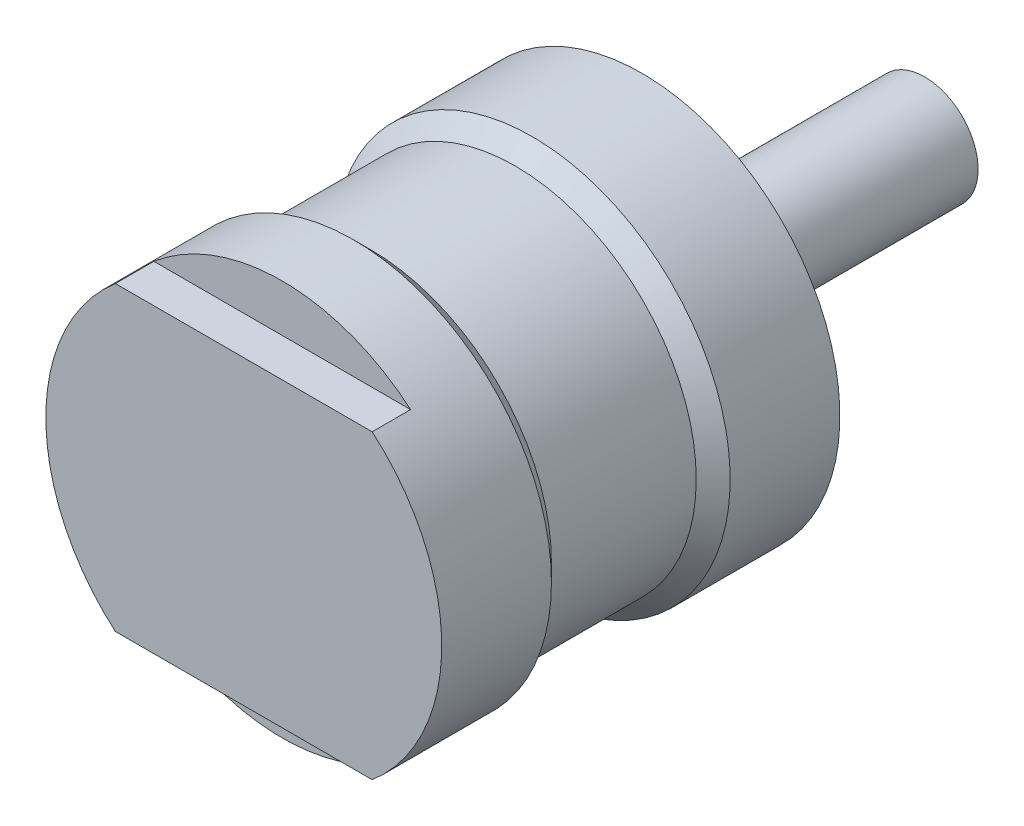
ISO-10303-21;
HEADER;
FILE_DESCRIPTION(('STEP AP214'),'2;1');
FILE_NAME('part.step','',(''),(''),'','','');
FILE_SCHEMA(('AUTOMOTIVE_DESIGN { 1 0 10303 214 1 1 1 1 }'));
ENDSEC;
DATA;
#1=APPLICATION_CONTEXT('core data for automotive mechanical design processes');
#2=APPLICATION_PROTOCOL_DEFINITION('international standard','automotive_design',2000,#1);
#3=PRODUCT_CONTEXT('',#1,'mechanical');
#4=PRODUCT('Part','Part','',(#3));
#5=PRODUCT_RELATED_PRODUCT_CATEGORY('part','',(#4));
#6=PRODUCT_DEFINITION_FORMATION('','',#4);
#7=PRODUCT_DEFINITION_CONTEXT('part definition',#1,'design');
#8=PRODUCT_DEFINITION('design','',#6,#7);
#9=PRODUCT_DEFINITION_SHAPE('','',#8);
#10=(LENGTH_UNIT() NAMED_UNIT(*) SI_UNIT(.MILLI.,.METRE.));
#11=(NAMED_UNIT(*) PLANE_ANGLE_UNIT() SI_UNIT($,.RADIAN.));
#12=(NAMED_UNIT(*) SI_UNIT($,.STERADIAN.) SOLID_ANGLE_UNIT());
#13=UNCERTAINTY_MEASURE_WITH_UNIT(LENGTH_MEASURE(1.E-05),#10,'distance_accuracy_value','');
#14=(GEOMETRIC_REPRESENTATION_CONTEXT(3) GLOBAL_UNCERTAINTY_ASSIGNED_CONTEXT((#13)) GLOBAL_UNIT_ASSIGNED_CONTEXT((#10,
#11,#12)) REPRESENTATION_CONTEXT('',''));
#15=CARTESIAN_POINT('',(0.,0.,0.));
#16=DIRECTION('',(0.,0.,1.));
#17=DIRECTION('',(1.,0.,0.));
#18=AXIS2_PLACEMENT_3D('',#15,#16,#17);
#19=CARTESIAN_POINT('',(0.,0.,-2.54));
#20=DIRECTION('',(0.,0.,-1.));
#21=DIRECTION('',(-1.,0.,0.));
#22=AXIS2_PLACEMENT_3D('',#19,#20,#21);
#23=PLANE('',#22);
#24=CARTESIAN_POINT('',(0.,0.,-2.54));
#25=DIRECTION('',(0.,0.,-1.));
#26=DIRECTION('',(-1.,0.,0.));
#27=AXIS2_PLACEMENT_3D('',#24,#25,#26);
#28=CIRCLE('',#27,3.937);
#29=CARTESIAN_POINT('',(-3.937,0.,-2.54));
#30=VERTEX_POINT('',#29);
#31=EDGE_CURVE('E380',#30,#30,#28,.T.);
#32=ORIENTED_EDGE('',*,*,#31,.T.);
#33=EDGE_LOOP('',(#32));
#34=FACE_BOUND('',#33,.T.);
#35=CARTESIAN_POINT('',(0.,0.,-2.54));
#36=DIRECTION('',(0.,0.,-1.));
#37=DIRECTION('',(-1.,0.,0.));
#38=AXIS2_PLACEMENT_3D('',#35,#36,#37);
#39=CIRCLE('',#38,2.9972);
#40=CARTESIAN_POINT('',(-2.9972,0.,-2.54));
#41=VERTEX_POINT('',#40);
#42=EDGE_CURVE('E371',#41,#41,#39,.T.);
#43=ORIENTED_EDGE('',*,*,#42,.F.);
#44=EDGE_LOOP('',(#43));
#45=FACE_BOUND('',#44,.T.);
#46=ADVANCED_FACE('F35',(#34,#45),#23,.T.);
#47=CARTESIAN_POINT('',(0.,0.,-0.762));
#48=DIRECTION('',(0.,0.,-1.));
#49=DIRECTION('',(-1.,0.,0.));
#50=AXIS2_PLACEMENT_3D('',#47,#48,#49);
#51=PLANE('',#50);
#52=CARTESIAN_POINT('',(0.,0.,-0.762));
#53=DIRECTION('',(0.,0.,-1.));
#54=DIRECTION('',(-1.,0.,0.));
#55=AXIS2_PLACEMENT_3D('',#52,#53,#54);
#56=CIRCLE('',#55,5.08);
#57=CARTESIAN_POINT('',(5.08,0.,-0.762));
#58=VERTEX_POINT('',#57);
#59=EDGE_CURVE('E97',#58,#58,#56,.T.);
#60=ORIENTED_EDGE('',*,*,#59,.T.);
#61=EDGE_LOOP('',(#60));
#62=FACE_BOUND('',#61,.T.);
#63=CARTESIAN_POINT('',(0.,0.,-0.762));
#64=DIRECTION('',(0.,0.,-1.));
#65=DIRECTION('',(-1.,0.,0.));
#66=AXIS2_PLACEMENT_3D('',#63,#64,#65);
#67=CIRCLE('',#66,3.937);
#68=CARTESIAN_POINT('',(-3.937,0.,-0.762));
#69=VERTEX_POINT('',#68);
#70=EDGE_CURVE('E377',#69,#69,#67,.T.);
#71=ORIENTED_EDGE('',*,*,#70,.F.);
#72=EDGE_LOOP('',(#71));
#73=FACE_BOUND('',#72,.T.);
#74=ADVANCED_FACE('F142',(#62,#73),#51,.T.);
#75=CARTESIAN_POINT('',(0.,0.,0.));
#76=DIRECTION('',(0.,0.,1.));
#77=DIRECTION('',(1.,0.,0.));
#78=AXIS2_PLACEMENT_3D('',#75,#76,#77);
#79=PLANE('',#78);
#80=CARTESIAN_POINT('',(3.5,6.06217782649107,0.));
#81=DIRECTION('',(0.,0.,-1.));
#82=DIRECTION('',(-1.,0.,0.));
#83=AXIS2_PLACEMENT_3D('',#80,#81,#82);
#84=CIRCLE('',#83,1.25);
#85=CARTESIAN_POINT('',(2.25,6.06217782649107,0.));
#86=VERTEX_POINT('',#85);
#87=EDGE_CURVE('E357',#86,#86,#84,.T.);
#88=ORIENTED_EDGE('',*,*,#87,.F.);
#89=EDGE_LOOP('',(#88));
#90=FACE_BOUND('',#89,.T.);
#91=CARTESIAN_POINT('',(3.5,-6.06217782649107,0.));
#92=DIRECTION('',(0.,0.,-1.));
#93=DIRECTION('',(-1.,0.,0.));
#94=AXIS2_PLACEMENT_3D('',#91,#92,#93);
#95=CIRCLE('',#94,1.25);
#96=CARTESIAN_POINT('',(2.25,-6.06217782649107,0.));
#97=VERTEX_POINT('',#96);
#98=EDGE_CURVE('E356',#97,#97,#95,.T.);
#99=ORIENTED_EDGE('',*,*,#98,.F.);
#100=EDGE_LOOP('',(#99));
#101=FACE_BOUND('',#100,.T.);
#102=CARTESIAN_POINT('',(-7.,0.,0.));
#103=DIRECTION('',(0.,0.,-1.));
#104=DIRECTION('',(-1.,0.,0.));
#105=AXIS2_PLACEMENT_3D('',#102,#103,#104);
#106=CIRCLE('',#105,1.25);
#107=CARTESIAN_POINT('',(-8.25,0.,0.));
#108=VERTEX_POINT('',#107);
#109=EDGE_CURVE('E366',#108,#108,#106,.T.);
#110=ORIENTED_EDGE('',*,*,#109,.F.);
#111=EDGE_LOOP('',(#110));
#112=FACE_BOUND('',#111,.T.);
#113=CARTESIAN_POINT('',(0.,0.,0.));
#114=DIRECTION('',(0.,0.,1.));
#115=DIRECTION('',(1.,0.,0.));
#116=AXIS2_PLACEMENT_3D('',#113,#114,#115);
#117=CIRCLE('',#116,11.1125);
#118=CARTESIAN_POINT('',(-11.1125,0.,0.));
#119=VERTEX_POINT('',#118);
#120=EDGE_CURVE('E113',#119,#119,#117,.T.);
#121=ORIENTED_EDGE('',*,*,#120,.F.);
#122=EDGE_LOOP('',(#121));
#123=FACE_BOUND('',#122,.T.);
#124=CARTESIAN_POINT('',(0.,0.,0.));
#125=DIRECTION('',(0.,0.,1.));
#126=DIRECTION('',(1.,0.,0.));
#127=AXIS2_PLACEMENT_3D('',#124,#125,#126);
#128=CIRCLE('',#127,5.08);
#129=CARTESIAN_POINT('',(5.08,0.,0.));
#130=VERTEX_POINT('',#129);
#131=EDGE_CURVE('E11',#130,#130,#128,.F.);
#132=ORIENTED_EDGE('',*,*,#131,.F.);
#133=EDGE_LOOP('',(#132));
#134=FACE_BOUND('',#133,.T.);
#135=ADVANCED_FACE('F148',(#90,#101,#112,#123,#134),#79,.F.);
#136=CARTESIAN_POINT('',(0.,0.,22.352));
#137=DIRECTION('',(0.,0.,-1.));
#138=DIRECTION('',(-1.,0.,0.));
#139=AXIS2_PLACEMENT_3D('',#136,#137,#138);
#140=CYLINDRICAL_SURFACE('',#139,11.1125);
#141=CARTESIAN_POINT('',(0.,0.,16.1925));
#142=DIRECTION('',(0.,0.,1.));
#143=DIRECTION('',(1.,0.,0.));
#144=AXIS2_PLACEMENT_3D('',#141,#142,#143);
#145=CIRCLE('',#144,11.1125);
#146=CARTESIAN_POINT('',(11.1125,0.,16.1925));
#147=VERTEX_POINT('',#146);
#148=EDGE_CURVE('E43',#147,#147,#145,.T.);
#149=ORIENTED_EDGE('',*,*,#148,.T.);
#150=EDGE_LOOP('',(#149));
#151=FACE_BOUND('',#150,.T.);
#152=DIRECTION('',(0.,0.,1.));
#153=VECTOR('',#152,1.);
#154=CARTESIAN_POINT('',(-7.20739266378626,-8.4582,20.193));
#155=LINE('',#154,#153);
#156=CARTESIAN_POINT('',(-7.20739266378626,-8.4582,20.193));
#157=VERTEX_POINT('',#156);
#158=CARTESIAN_POINT('',(-7.20739266378626,-8.4582,22.352));
#159=VERTEX_POINT('',#158);
#160=EDGE_CURVE('E76',#157,#159,#155,.T.);
#161=ORIENTED_EDGE('',*,*,#160,.T.);
#162=CARTESIAN_POINT('',(0.,0.,22.352));
#163=DIRECTION('',(0.,0.,1.));
#164=DIRECTION('',(1.,0.,0.));
#165=AXIS2_PLACEMENT_3D('',#162,#163,#164);
#166=CIRCLE('',#165,11.1125);
#167=CARTESIAN_POINT('',(-7.20739266378626,8.4582,22.352));
#168=VERTEX_POINT('',#167);
#169=EDGE_CURVE('E111',#168,#159,#166,.T.);
#170=ORIENTED_EDGE('',*,*,#169,.F.);
#171=DIRECTION('',(0.,0.,1.));
#172=VECTOR('',#171,1.);
#173=CARTESIAN_POINT('',(-7.20739266378626,8.4582,20.193));
#174=LINE('',#173,#172);
#175=CARTESIAN_POINT('',(-7.20739266378626,8.4582,20.193));
#176=VERTEX_POINT('',#175);
#177=EDGE_CURVE('E58',#176,#168,#174,.T.);
#178=ORIENTED_EDGE('',*,*,#177,.F.);
#179=CARTESIAN_POINT('',(0.,0.,20.193));
#180=DIRECTION('',(0.,0.,1.));
#181=DIRECTION('',(1.,0.,0.));
#182=AXIS2_PLACEMENT_3D('',#179,#180,#181);
#183=CIRCLE('',#182,11.1125);
#184=CARTESIAN_POINT('',(7.20739266378626,8.4582,20.193));
#185=VERTEX_POINT('',#184);
#186=EDGE_CURVE('E100',#185,#176,#183,.T.);
#187=ORIENTED_EDGE('',*,*,#186,.F.);
#188=DIRECTION('',(0.,0.,1.));
#189=VECTOR('',#188,1.);
#190=CARTESIAN_POINT('',(7.20739266378626,8.4582,20.193));
#191=LINE('',#190,#189);
#192=CARTESIAN_POINT('',(7.20739266378626,8.4582,22.352));
#193=VERTEX_POINT('',#192);
#194=EDGE_CURVE('E106',#185,#193,#191,.T.);
#195=ORIENTED_EDGE('',*,*,#194,.T.);
#196=CARTESIAN_POINT('',(7.20739266378626,-8.4582,22.352));
#197=VERTEX_POINT('',#196);
#198=EDGE_CURVE('E109',#197,#193,#166,.T.);
#199=ORIENTED_EDGE('',*,*,#198,.F.);
#200=DIRECTION('',(0.,0.,1.));
#201=VECTOR('',#200,1.);
#202=CARTESIAN_POINT('',(7.20739266378626,-8.4582,20.193));
#203=LINE('',#202,#201);
#204=CARTESIAN_POINT('',(7.20739266378626,-8.4582,20.193));
#205=VERTEX_POINT('',#204);
#206=EDGE_CURVE('E50',#205,#197,#203,.T.);
#207=ORIENTED_EDGE('',*,*,#206,.F.);
#208=CARTESIAN_POINT('',(0.,0.,20.193));
#209=DIRECTION('',(0.,0.,1.));
#210=DIRECTION('',(1.,0.,0.));
#211=AXIS2_PLACEMENT_3D('',#208,#209,#210);
#212=CIRCLE('',#211,11.1125);
#213=EDGE_CURVE('E86',#157,#205,#212,.T.);
#214=ORIENTED_EDGE('',*,*,#213,.F.);
#215=EDGE_LOOP('',(#161,#170,#178,#187,#195,#199,#207,#214));
#216=FACE_BOUND('',#215,.T.);
#217=ADVANCED_FACE('F91',(#151,#216),#140,.T.);
#218=CARTESIAN_POINT('',(0.,0.,22.352));
#219=DIRECTION('',(0.,0.,1.));
#220=DIRECTION('',(1.,0.,0.));
#221=AXIS2_PLACEMENT_3D('',#218,#219,#220);
#222=PLANE('',#221);
#223=ORIENTED_EDGE('',*,*,#169,.T.);
#224=DIRECTION('',(1.,0.,0.));
#225=VECTOR('',#224,1.);
#226=CARTESIAN_POINT('',(0.,-8.4582,22.352));
#227=LINE('',#226,#225);
#228=EDGE_CURVE('E81',#159,#197,#227,.T.);
#229=ORIENTED_EDGE('',*,*,#228,.T.);
#230=ORIENTED_EDGE('',*,*,#198,.T.);
#231=DIRECTION('',(1.,0.,0.));
#232=VECTOR('',#231,1.);
#233=CARTESIAN_POINT('',(0.,8.4582,22.352));
#234=LINE('',#233,#232);
#235=EDGE_CURVE('E98',#168,#193,#234,.T.);
#236=ORIENTED_EDGE('',*,*,#235,.F.);
#237=EDGE_LOOP('',(#223,#229,#230,#236));
#238=FACE_BOUND('',#237,.T.);
#239=ADVANCED_FACE('F172',(#238),#222,.T.);
#240=CARTESIAN_POINT('',(0.,0.,6.096));
#241=DIRECTION('',(0.,0.,-1.));
#242=DIRECTION('',(-1.,0.,0.));
#243=AXIS2_PLACEMENT_3D('',#240,#241,#242);
#244=CYLINDRICAL_SURFACE('',#243,11.1125);
#245=CARTESIAN_POINT('',(0.,0.,6.15950000000001));
#246=DIRECTION('',(0.,0.,-1.));
#247=DIRECTION('',(-1.,0.,0.));
#248=AXIS2_PLACEMENT_3D('',#245,#246,#247);
#249=CIRCLE('',#248,11.1125);
#250=CARTESIAN_POINT('',(-11.1125,0.,6.15950000000001));
#251=VERTEX_POINT('',#250);
#252=EDGE_CURVE('E122',#251,#251,#249,.T.);
#253=CARTESIAN_POINT('',(-11.1125,0.,6.15950000000001));
#254=CARTESIAN_POINT('',(-11.1125,0.,6.09533854166668));
#255=CARTESIAN_POINT('',(-11.1125,0.,6.03117708333334));
#256=CARTESIAN_POINT('',(-11.1125,0.,5.90285416666668));
#257=CARTESIAN_POINT('',(-11.1125,0.,5.83869270833334));
#258=CARTESIAN_POINT('',(-11.1125,0.,5.71036979166668));
#259=CARTESIAN_POINT('',(-11.1125,0.,5.64620833333334));
#260=CARTESIAN_POINT('',(-11.1125,0.,5.51788541666668));
#261=CARTESIAN_POINT('',(-11.1125,0.,5.45372395833334));
#262=CARTESIAN_POINT('',(-11.1125,0.,5.32540104166668));
#263=CARTESIAN_POINT('',(-11.1125,0.,5.26123958333334));
#264=CARTESIAN_POINT('',(-11.1125,0.,5.13291666666668));
#265=CARTESIAN_POINT('',(-11.1125,0.,5.06875520833334));
#266=CARTESIAN_POINT('',(-11.1125,0.,4.94043229166668));
#267=CARTESIAN_POINT('',(-11.1125,0.,4.87627083333334));
#268=CARTESIAN_POINT('',(-11.1125,0.,4.74794791666667));
#269=CARTESIAN_POINT('',(-11.1125,0.,4.68378645833334));
#270=CARTESIAN_POINT('',(-11.1125,0.,4.55546354166667));
#271=CARTESIAN_POINT('',(-11.1125,0.,4.49130208333334));
#272=CARTESIAN_POINT('',(-11.1125,0.,4.36297916666667));
#273=CARTESIAN_POINT('',(-11.1125,0.,4.29881770833334));
#274=CARTESIAN_POINT('',(-11.1125,0.,4.17049479166667));
#275=CARTESIAN_POINT('',(-11.1125,0.,4.10633333333334));
#276=CARTESIAN_POINT('',(-11.1125,0.,3.97801041666667));
#277=CARTESIAN_POINT('',(-11.1125,0.,3.91384895833334));
#278=CARTESIAN_POINT('',(-11.1125,0.,3.78552604166667));
#279=CARTESIAN_POINT('',(-11.1125,0.,3.72136458333334));
#280=CARTESIAN_POINT('',(-11.1125,0.,3.59304166666667));
#281=CARTESIAN_POINT('',(-11.1125,0.,3.52888020833334));
#282=CARTESIAN_POINT('',(-11.1125,0.,3.40055729166667));
#283=CARTESIAN_POINT('',(-11.1125,0.,3.33639583333334));
#284=CARTESIAN_POINT('',(-11.1125,0.,3.20807291666667));
#285=CARTESIAN_POINT('',(-11.1125,0.,3.14391145833334));
#286=CARTESIAN_POINT('',(-11.1125,0.,3.01558854166667));
#287=CARTESIAN_POINT('',(-11.1125,0.,2.95142708333334));
#288=CARTESIAN_POINT('',(-11.1125,0.,2.82310416666667));
#289=CARTESIAN_POINT('',(-11.1125,0.,2.75894270833334));
#290=CARTESIAN_POINT('',(-11.1125,0.,2.63061979166667));
#291=CARTESIAN_POINT('',(-11.1125,0.,2.56645833333334));
#292=CARTESIAN_POINT('',(-11.1125,0.,2.43813541666667));
#293=CARTESIAN_POINT('',(-11.1125,0.,2.37397395833334));
#294=CARTESIAN_POINT('',(-11.1125,0.,2.24565104166667));
#295=CARTESIAN_POINT('',(-11.1125,0.,2.18148958333334));
#296=CARTESIAN_POINT('',(-11.1125,0.,2.05316666666667));
#297=CARTESIAN_POINT('',(-11.1125,0.,1.98900520833334));
#298=CARTESIAN_POINT('',(-11.1125,0.,1.86068229166667));
#299=CARTESIAN_POINT('',(-11.1125,0.,1.79652083333334));
#300=CARTESIAN_POINT('',(-11.1125,0.,1.66819791666667));
#301=CARTESIAN_POINT('',(-11.1125,0.,1.60403645833334));
#302=CARTESIAN_POINT('',(-11.1125,0.,1.47571354166667));
#303=CARTESIAN_POINT('',(-11.1125,0.,1.41155208333334));
#304=CARTESIAN_POINT('',(-11.1125,0.,1.28322916666667));
#305=CARTESIAN_POINT('',(-11.1125,0.,1.21906770833334));
#306=CARTESIAN_POINT('',(-11.1125,0.,1.09074479166667));
#307=CARTESIAN_POINT('',(-11.1125,0.,1.02658333333334));
#308=CARTESIAN_POINT('',(-11.1125,0.,0.898260416666669));
#309=CARTESIAN_POINT('',(-11.1125,0.,0.834098958333335));
#310=CARTESIAN_POINT('',(-11.1125,0.,0.705776041666668));
#311=CARTESIAN_POINT('',(-11.1125,0.,0.641614583333335));
#312=CARTESIAN_POINT('',(-11.1125,0.,0.513291666666668));
#313=CARTESIAN_POINT('',(-11.1125,0.,0.449130208333335));
#314=CARTESIAN_POINT('',(-11.1125,0.,0.320807291666668));
#315=CARTESIAN_POINT('',(-11.1125,0.,0.256645833333334));
#316=CARTESIAN_POINT('',(-11.1125,0.,0.128322916666667));
#317=CARTESIAN_POINT('',(-11.1125,0.,0.0641614583333337));
#318=CARTESIAN_POINT('',(-11.1125,0.,0.));
#319=B_SPLINE_CURVE_WITH_KNOTS('',3,(#253,#254,#255,#256,#257,#258,#259,#260,#261,#262,#263,
#264,#265,#266,#267,#268,#269,#270,#271,#272,#273,#274,#275,#276,#277,#278,#279,#280,#281,#282,
#283,#284,#285,#286,#287,#288,#289,#290,#291,#292,#293,#294,#295,#296,#297,#298,#299,#300,#301,
#302,#303,#304,#305,#306,#307,#308,#309,#310,#311,#312,#313,#314,#315,#316,#317,#318),
.UNSPECIFIED.,.F.,.F.,(4,2,2,2,2,2,2,2,2,2,2,2,2,2,2,2,2,2,2,2,2,2,2,2,2,2,2,2,2,2,2,2,4),(0.,
0.192484375,0.38496875,0.577453125,0.769937500000001,0.962421875000001,1.15490625,1.347390625,
1.539875,1.732359375,1.92484375,2.117328125,2.3098125,2.502296875,2.69478125,2.887265625,
3.07975,3.272234375,3.46471875000001,3.65720312500001,3.84968750000001,4.04217187500001,
4.23465625000001,4.42714062500001,4.61962500000001,4.81210937500001,5.00459375000001,
5.19707812500001,5.38956250000001,5.58204687500001,5.77453125000001,5.96701562500001,
6.15950000000001),.UNSPECIFIED.);
#320=EDGE_CURVE('BSEAM175',#251,#119,#319,.T.);
#321=ORIENTED_EDGE('',*,*,#252,.T.);
#322=ORIENTED_EDGE('',*,*,#120,.T.);
#323=ORIENTED_EDGE('',*,*,#320,.T.);
#324=ORIENTED_EDGE('',*,*,#320,.F.);
#325=EDGE_LOOP('',(#321,#323,#322,#324));
#326=FACE_BOUND('',#325,.T.);
#327=ADVANCED_FACE('F175',(#326),#244,.T.);
#328=CARTESIAN_POINT('',(0.,0.,16.256));
#329=DIRECTION('',(0.,0.,-1.));
#330=DIRECTION('',(-1.,0.,0.));
#331=AXIS2_PLACEMENT_3D('',#328,#329,#330);
#332=CYLINDRICAL_SURFACE('',#331,10.16);
#333=CARTESIAN_POINT('',(0.,0.,7.11200000000002));
#334=DIRECTION('',(0.,0.,1.));
#335=DIRECTION('',(1.,0.,0.));
#336=AXIS2_PLACEMENT_3D('',#333,#334,#335);
#337=CIRCLE('',#336,10.16);
#338=CARTESIAN_POINT('',(10.16,0.,7.11200000000002));
#339=VERTEX_POINT('',#338);
#340=EDGE_CURVE('E119',#339,#339,#337,.T.);
#341=ORIENTED_EDGE('',*,*,#340,.T.);
#342=EDGE_LOOP('',(#341));
#343=FACE_BOUND('',#342,.T.);
#344=CARTESIAN_POINT('',(0.,0.,15.24));
#345=DIRECTION('',(0.,0.,1.));
#346=DIRECTION('',(1.,0.,0.));
#347=AXIS2_PLACEMENT_3D('',#344,#345,#346);
#348=CIRCLE('',#347,10.16);
#349=CARTESIAN_POINT('',(10.16,0.,15.24));
#350=VERTEX_POINT('',#349);
#351=EDGE_CURVE('E116',#350,#350,#348,.F.);
#352=ORIENTED_EDGE('',*,*,#351,.T.);
#353=EDGE_LOOP('',(#352));
#354=FACE_BOUND('',#353,.T.);
#355=ADVANCED_FACE('F171',(#343,#354),#332,.T.);
#356=CARTESIAN_POINT('',(0.,8.4582,20.193));
#357=DIRECTION('',(0.,-1.,0.));
#358=DIRECTION('',(0.,0.,-1.));
#359=AXIS2_PLACEMENT_3D('',#356,#357,#358);
#360=PLANE('',#359);
#361=ORIENTED_EDGE('',*,*,#235,.T.);
#362=ORIENTED_EDGE('',*,*,#194,.F.);
#363=DIRECTION('',(1.,0.,0.));
#364=VECTOR('',#363,1.);
#365=CARTESIAN_POINT('',(0.,8.4582,20.193));
#366=LINE('',#365,#364);
#367=EDGE_CURVE('E102',#176,#185,#366,.T.);
#368=ORIENTED_EDGE('',*,*,#367,.F.);
#369=ORIENTED_EDGE('',*,*,#177,.T.);
#370=EDGE_LOOP('',(#361,#362,#368,#369));
#371=FACE_BOUND('',#370,.T.);
#372=ADVANCED_FACE('F167',(#371),#360,.F.);
#373=CARTESIAN_POINT('',(0.,0.,20.193));
#374=DIRECTION('',(0.,0.,1.));
#375=DIRECTION('',(1.,0.,0.));
#376=AXIS2_PLACEMENT_3D('',#373,#374,#375);
#377=PLANE('',#376);
#378=ORIENTED_EDGE('',*,*,#186,.T.);
#379=ORIENTED_EDGE('',*,*,#367,.T.);
#380=EDGE_LOOP('',(#378,#379));
#381=FACE_BOUND('',#380,.T.);
#382=ADVANCED_FACE('F164',(#381),#377,.T.);
#383=CARTESIAN_POINT('',(0.,-8.4582,20.193));
#384=DIRECTION('',(0.,-1.,0.));
#385=DIRECTION('',(1.,0.,0.));
#386=AXIS2_PLACEMENT_3D('',#383,#384,#385);
#387=PLANE('',#386);
#388=ORIENTED_EDGE('',*,*,#228,.F.);
#389=ORIENTED_EDGE('',*,*,#160,.F.);
#390=DIRECTION('',(1.,0.,0.));
#391=VECTOR('',#390,1.);
#392=CARTESIAN_POINT('',(0.,-8.4582,20.193));
#393=LINE('',#392,#391);
#394=EDGE_CURVE('E79',#157,#205,#393,.T.);
#395=ORIENTED_EDGE('',*,*,#394,.T.);
#396=ORIENTED_EDGE('',*,*,#206,.T.);
#397=EDGE_LOOP('',(#388,#389,#395,#396));
#398=FACE_BOUND('',#397,.T.);
#399=ADVANCED_FACE('F78',(#398),#387,.T.);
#400=CARTESIAN_POINT('',(0.,0.,20.193));
#401=DIRECTION('',(0.,0.,1.));
#402=DIRECTION('',(1.,0.,0.));
#403=AXIS2_PLACEMENT_3D('',#400,#401,#402);
#404=PLANE('',#403);
#405=ORIENTED_EDGE('',*,*,#394,.F.);
#406=ORIENTED_EDGE('',*,*,#213,.T.);
#407=EDGE_LOOP('',(#405,#406));
#408=FACE_BOUND('',#407,.T.);
#409=ADVANCED_FACE('F89',(#408),#404,.T.);
#410=CARTESIAN_POINT('',(0.,0.,7.11200000000002));
#411=DIRECTION('',(0.,0.,-1.));
#412=DIRECTION('',(-1.,0.,0.));
#413=AXIS2_PLACEMENT_3D('',#410,#411,#412);
#414=CONICAL_SURFACE('',#413,10.16,0.785398163397443);
#415=ORIENTED_EDGE('',*,*,#252,.F.);
#416=EDGE_LOOP('',(#415));
#417=FACE_BOUND('',#416,.T.);
#418=ORIENTED_EDGE('',*,*,#340,.F.);
#419=EDGE_LOOP('',(#418));
#420=FACE_BOUND('',#419,.T.);
#421=ADVANCED_FACE('F130',(#417,#420),#414,.T.);
#422=CARTESIAN_POINT('',(0.,0.,16.256));
#423=DIRECTION('',(0.,0.,1.));
#424=DIRECTION('',(1.,0.,0.));
#425=AXIS2_PLACEMENT_3D('',#422,#423,#424);
#426=CONICAL_SURFACE('',#425,11.176,0.785398163397454);
#427=ORIENTED_EDGE('',*,*,#351,.F.);
#428=EDGE_LOOP('',(#427));
#429=FACE_BOUND('',#428,.T.);
#430=ORIENTED_EDGE('',*,*,#148,.F.);
#431=EDGE_LOOP('',(#430));
#432=FACE_BOUND('',#431,.T.);
#433=ADVANCED_FACE('F37',(#429,#432),#426,.T.);
#434=CARTESIAN_POINT('',(0.,0.,-0.762));
#435=DIRECTION('',(0.,0.,1.));
#436=DIRECTION('',(1.,0.,0.));
#437=AXIS2_PLACEMENT_3D('',#434,#435,#436);
#438=CYLINDRICAL_SURFACE('',#437,5.08);
#439=CARTESIAN_POINT('',(5.08,0.,-0.762));
#440=CARTESIAN_POINT('',(5.08,0.,-0.7540625));
#441=CARTESIAN_POINT('',(5.08,0.,-0.746125));
#442=CARTESIAN_POINT('',(5.08,0.,-0.73025));
#443=CARTESIAN_POINT('',(5.08,0.,-0.7223125));
#444=CARTESIAN_POINT('',(5.08,0.,-0.7064375));
#445=CARTESIAN_POINT('',(5.08,0.,-0.6985));
#446=CARTESIAN_POINT('',(5.08,0.,-0.682625));
#447=CARTESIAN_POINT('',(5.08,0.,-0.6746875));
#448=CARTESIAN_POINT('',(5.08,0.,-0.6588125));
#449=CARTESIAN_POINT('',(5.08,0.,-0.650875));
#450=CARTESIAN_POINT('',(5.08,0.,-0.635));
#451=CARTESIAN_POINT('',(5.08,0.,-0.6270625));
#452=CARTESIAN_POINT('',(5.08,0.,-0.6111875));
#453=CARTESIAN_POINT('',(5.08,0.,-0.60325));
#454=CARTESIAN_POINT('',(5.08,0.,-0.587375));
#455=CARTESIAN_POINT('',(5.08,0.,-0.5794375));
#456=CARTESIAN_POINT('',(5.08,0.,-0.5635625));
#457=CARTESIAN_POINT('',(5.08,0.,-0.555625));
#458=CARTESIAN_POINT('',(5.08,0.,-0.53975));
#459=CARTESIAN_POINT('',(5.08,0.,-0.5318125));
#460=CARTESIAN_POINT('',(5.08,0.,-0.5159375));
#461=CARTESIAN_POINT('',(5.08,0.,-0.508));
#462=CARTESIAN_POINT('',(5.08,0.,-0.492125));
#463=CARTESIAN_POINT('',(5.08,0.,-0.4841875));
#464=CARTESIAN_POINT('',(5.08,0.,-0.4683125));
#465=CARTESIAN_POINT('',(5.08,0.,-0.460375));
#466=CARTESIAN_POINT('',(5.08,0.,-0.4445));
#467=CARTESIAN_POINT('',(5.08,0.,-0.4365625));
#468=CARTESIAN_POINT('',(5.08,0.,-0.4206875));
#469=CARTESIAN_POINT('',(5.08,0.,-0.41275));
#470=CARTESIAN_POINT('',(5.08,0.,-0.396875));
#471=CARTESIAN_POINT('',(5.08,0.,-0.3889375));
#472=CARTESIAN_POINT('',(5.08,0.,-0.3730625));
#473=CARTESIAN_POINT('',(5.08,0.,-0.365125));
#474=CARTESIAN_POINT('',(5.08,0.,-0.34925));
#475=CARTESIAN_POINT('',(5.08,0.,-0.3413125));
#476=CARTESIAN_POINT('',(5.08,0.,-0.3254375));
#477=CARTESIAN_POINT('',(5.08,0.,-0.3175));
#478=CARTESIAN_POINT('',(5.08,0.,-0.301625));
#479=CARTESIAN_POINT('',(5.08,0.,-0.2936875));
#480=CARTESIAN_POINT('',(5.08,0.,-0.2778125));
#481=CARTESIAN_POINT('',(5.08,0.,-0.269875));
#482=CARTESIAN_POINT('',(5.08,0.,-0.254));
#483=CARTESIAN_POINT('',(5.08,0.,-0.2460625));
#484=CARTESIAN_POINT('',(5.08,0.,-0.2301875));
#485=CARTESIAN_POINT('',(5.08,0.,-0.22225));
#486=CARTESIAN_POINT('',(5.08,0.,-0.206375));
#487=CARTESIAN_POINT('',(5.08,0.,-0.1984375));
#488=CARTESIAN_POINT('',(5.08,0.,-0.1825625));
#489=CARTESIAN_POINT('',(5.08,0.,-0.174625));
#490=CARTESIAN_POINT('',(5.08,0.,-0.15875));
#491=CARTESIAN_POINT('',(5.08,0.,-0.1508125));
#492=CARTESIAN_POINT('',(5.08,0.,-0.1349375));
#493=CARTESIAN_POINT('',(5.08,0.,-0.127));
#494=CARTESIAN_POINT('',(5.08,0.,-0.111125));
#495=CARTESIAN_POINT('',(5.08,0.,-0.1031875));
#496=CARTESIAN_POINT('',(5.08,0.,-0.0873125));
#497=CARTESIAN_POINT('',(5.08,0.,-0.079375));
#498=CARTESIAN_POINT('',(5.08,0.,-0.0635));
#499=CARTESIAN_POINT('',(5.08,0.,-0.0555625));
#500=CARTESIAN_POINT('',(5.08,0.,-0.0396875));
#501=CARTESIAN_POINT('',(5.08,0.,-0.03175));
#502=CARTESIAN_POINT('',(5.08,0.,-0.015875));
#503=CARTESIAN_POINT('',(5.08,0.,-0.00793749999999999));
#504=CARTESIAN_POINT('',(5.08,0.,0.));
#505=B_SPLINE_CURVE_WITH_KNOTS('',3,(#439,#440,#441,#442,#443,#444,#445,#446,#447,#448,#449,
#450,#451,#452,#453,#454,#455,#456,#457,#458,#459,#460,#461,#462,#463,#464,#465,#466,#467,#468,
#469,#470,#471,#472,#473,#474,#475,#476,#477,#478,#479,#480,#481,#482,#483,#484,#485,#486,#487,
#488,#489,#490,#491,#492,#493,#494,#495,#496,#497,#498,#499,#500,#501,#502,#503,#504),
.UNSPECIFIED.,.F.,.F.,(4,2,2,2,2,2,2,2,2,2,2,2,2,2,2,2,2,2,2,2,2,2,2,2,2,2,2,2,2,2,2,2,4),(0.,
0.0238125,0.0476249999999999,0.0714374999999999,0.09525,0.1190625,0.142875,0.1666875,0.1905,
0.2143125,0.238125,0.2619375,0.28575,0.3095625,0.333375,0.3571875,0.381,0.4048125,0.428625,
0.4524375,0.47625,0.5000625,0.523875,0.5476875,0.5715,0.5953125,0.619125,0.6429375,0.66675,
0.6905625,0.714375,0.7381875,0.762),.UNSPECIFIED.);
#506=EDGE_CURVE('BSEAM129',#58,#130,#505,.T.);
#507=ORIENTED_EDGE('',*,*,#59,.F.);
#508=ORIENTED_EDGE('',*,*,#131,.T.);
#509=ORIENTED_EDGE('',*,*,#506,.T.);
#510=ORIENTED_EDGE('',*,*,#506,.F.);
#511=EDGE_LOOP('',(#507,#509,#508,#510));
#512=FACE_BOUND('',#511,.T.);
#513=ADVANCED_FACE('F129',(#512),#438,.T.);
#514=CARTESIAN_POINT('',(0.,0.,-2.54));
#515=DIRECTION('',(0.,0.,1.));
#516=DIRECTION('',(1.,0.,0.));
#517=AXIS2_PLACEMENT_3D('',#514,#515,#516);
#518=CYLINDRICAL_SURFACE('',#517,3.937);
#519=ORIENTED_EDGE('',*,*,#31,.F.);
#520=EDGE_LOOP('',(#519));
#521=FACE_BOUND('',#520,.T.);
#522=ORIENTED_EDGE('',*,*,#70,.T.);
#523=EDGE_LOOP('',(#522));
#524=FACE_BOUND('',#523,.T.);
#525=ADVANCED_FACE('F136',(#521,#524),#518,.T.);
#526=CARTESIAN_POINT('',(0.,0.,-15.875));
#527=DIRECTION('',(0.,0.,1.));
#528=DIRECTION('',(1.,0.,0.));
#529=AXIS2_PLACEMENT_3D('',#526,#527,#528);
#530=CYLINDRICAL_SURFACE('',#529,2.9972);
#531=CARTESIAN_POINT('',(0.,0.,-15.875));
#532=DIRECTION('',(0.,0.,-1.));
#533=DIRECTION('',(-1.,0.,0.));
#534=AXIS2_PLACEMENT_3D('',#531,#532,#533);
#535=CIRCLE('',#534,2.9972);
#536=CARTESIAN_POINT('',(-2.9972,0.,-15.875));
#537=VERTEX_POINT('',#536);
#538=EDGE_CURVE('E374',#537,#537,#535,.T.);
#539=ORIENTED_EDGE('',*,*,#538,.F.);
#540=EDGE_LOOP('',(#539));
#541=FACE_BOUND('',#540,.T.);
#542=ORIENTED_EDGE('',*,*,#42,.T.);
#543=EDGE_LOOP('',(#542));
#544=FACE_BOUND('',#543,.T.);
#545=ADVANCED_FACE('F155',(#541,#544),#530,.T.);
#546=CARTESIAN_POINT('',(0.,0.,-15.875));
#547=DIRECTION('',(0.,0.,-1.));
#548=DIRECTION('',(-1.,0.,0.));
#549=AXIS2_PLACEMENT_3D('',#546,#547,#548);
#550=PLANE('',#549);
#551=ORIENTED_EDGE('',*,*,#538,.T.);
#552=EDGE_LOOP('',(#551));
#553=FACE_BOUND('',#552,.T.);
#554=ADVANCED_FACE('F271',(#553),#550,.T.);
#555=CARTESIAN_POINT('',(-7.,0.,7.747));
#556=DIRECTION('',(0.,0.,-1.));
#557=DIRECTION('',(-1.,0.,0.));
#558=AXIS2_PLACEMENT_3D('',#555,#556,#557);
#559=CYLINDRICAL_SURFACE('',#558,1.25);
#560=CARTESIAN_POINT('',(-7.,0.,7.747));
#561=DIRECTION('',(0.,0.,-1.));
#562=DIRECTION('',(-1.,0.,0.));
#563=AXIS2_PLACEMENT_3D('',#560,#561,#562);
#564=CIRCLE('',#563,1.25);
#565=CARTESIAN_POINT('',(-8.25,0.,7.747));
#566=VERTEX_POINT('',#565);
#567=EDGE_CURVE('E368',#566,#566,#564,.T.);
#568=ORIENTED_EDGE('',*,*,#567,.F.);
#569=EDGE_LOOP('',(#568));
#570=FACE_BOUND('',#569,.T.);
#571=ORIENTED_EDGE('',*,*,#109,.T.);
#572=EDGE_LOOP('',(#571));
#573=FACE_BOUND('',#572,.T.);
#574=ADVANCED_FACE('F281',(#570,#573),#559,.F.);
#575=CARTESIAN_POINT('',(-7.,0.,7.747));
#576=DIRECTION('',(0.,0.,-1.));
#577=DIRECTION('',(-1.,0.,0.));
#578=AXIS2_PLACEMENT_3D('',#575,#576,#577);
#579=PLANE('',#578);
#580=ORIENTED_EDGE('',*,*,#567,.T.);
#581=EDGE_LOOP('',(#580));
#582=FACE_BOUND('',#581,.T.);
#583=ADVANCED_FACE('F297',(#582),#579,.T.);
#584=CARTESIAN_POINT('',(3.5,-6.06217782649107,7.747));
#585=DIRECTION('',(0.,0.,-1.));
#586=DIRECTION('',(-1.,0.,0.));
#587=AXIS2_PLACEMENT_3D('',#584,#585,#586);
#588=CYLINDRICAL_SURFACE('',#587,1.25);
#589=CARTESIAN_POINT('',(3.5,-6.06217782649107,7.747));
#590=DIRECTION('',(0.,0.,-1.));
#591=DIRECTION('',(-1.,0.,0.));
#592=AXIS2_PLACEMENT_3D('',#589,#590,#591);
#593=CIRCLE('',#592,1.25);
#594=CARTESIAN_POINT('',(2.25,-6.06217782649107,7.747));
#595=VERTEX_POINT('',#594);
#596=EDGE_CURVE('E360',#595,#595,#593,.T.);
#597=ORIENTED_EDGE('',*,*,#596,.F.);
#598=EDGE_LOOP('',(#597));
#599=FACE_BOUND('',#598,.T.);
#600=ORIENTED_EDGE('',*,*,#98,.T.);
#601=EDGE_LOOP('',(#600));
#602=FACE_BOUND('',#601,.T.);
#603=ADVANCED_FACE('F308',(#599,#602),#588,.F.);
#604=CARTESIAN_POINT('',(3.5,-6.06217782649107,7.747));
#605=DIRECTION('',(0.,0.,-1.));
#606=DIRECTION('',(-1.,0.,0.));
#607=AXIS2_PLACEMENT_3D('',#604,#605,#606);
#608=PLANE('',#607);
#609=ORIENTED_EDGE('',*,*,#596,.T.);
#610=EDGE_LOOP('',(#609));
#611=FACE_BOUND('',#610,.T.);
#612=ADVANCED_FACE('F318',(#611),#608,.T.);
#613=CARTESIAN_POINT('',(3.5,6.06217782649107,7.747));
#614=DIRECTION('',(0.,0.,-1.));
#615=DIRECTION('',(-1.,0.,0.));
#616=AXIS2_PLACEMENT_3D('',#613,#614,#615);
#617=CYLINDRICAL_SURFACE('',#616,1.25);
#618=CARTESIAN_POINT('',(3.5,6.06217782649107,7.747));
#619=DIRECTION('',(0.,0.,-1.));
#620=DIRECTION('',(-1.,0.,0.));
#621=AXIS2_PLACEMENT_3D('',#618,#619,#620);
#622=CIRCLE('',#621,1.25);
#623=CARTESIAN_POINT('',(2.25,6.06217782649107,7.747));
#624=VERTEX_POINT('',#623);
#625=EDGE_CURVE('E355',#624,#624,#622,.T.);
#626=ORIENTED_EDGE('',*,*,#625,.F.);
#627=EDGE_LOOP('',(#626));
#628=FACE_BOUND('',#627,.T.);
#629=ORIENTED_EDGE('',*,*,#87,.T.);
#630=EDGE_LOOP('',(#629));
#631=FACE_BOUND('',#630,.T.);
#632=ADVANCED_FACE('F328',(#628,#631),#617,.F.);
#633=CARTESIAN_POINT('',(3.5,6.06217782649107,7.747));
#634=DIRECTION('',(0.,0.,-1.));
#635=DIRECTION('',(-1.,0.,0.));
#636=AXIS2_PLACEMENT_3D('',#633,#634,#635);
#637=PLANE('',#636);
#638=ORIENTED_EDGE('',*,*,#625,.T.);
#639=EDGE_LOOP('',(#638));
#640=FACE_BOUND('',#639,.T.);
#641=ADVANCED_FACE('F338',(#640),#637,.T.);
#642=CLOSED_SHELL('',(#46,#74,#135,#217,#239,#327,#355,#372,#382,#399,#409,#421,#433,#513,#525,
#545,#554,#574,#583,#603,#612,#632,#641));
#643=MANIFOLD_SOLID_BREP('B2',#642);
#644=ADVANCED_BREP_SHAPE_REPRESENTATION('',(#18,#643),#14);
#645=SHAPE_DEFINITION_REPRESENTATION(#9,#644);
ENDSEC;
END-ISO-10303-21;
